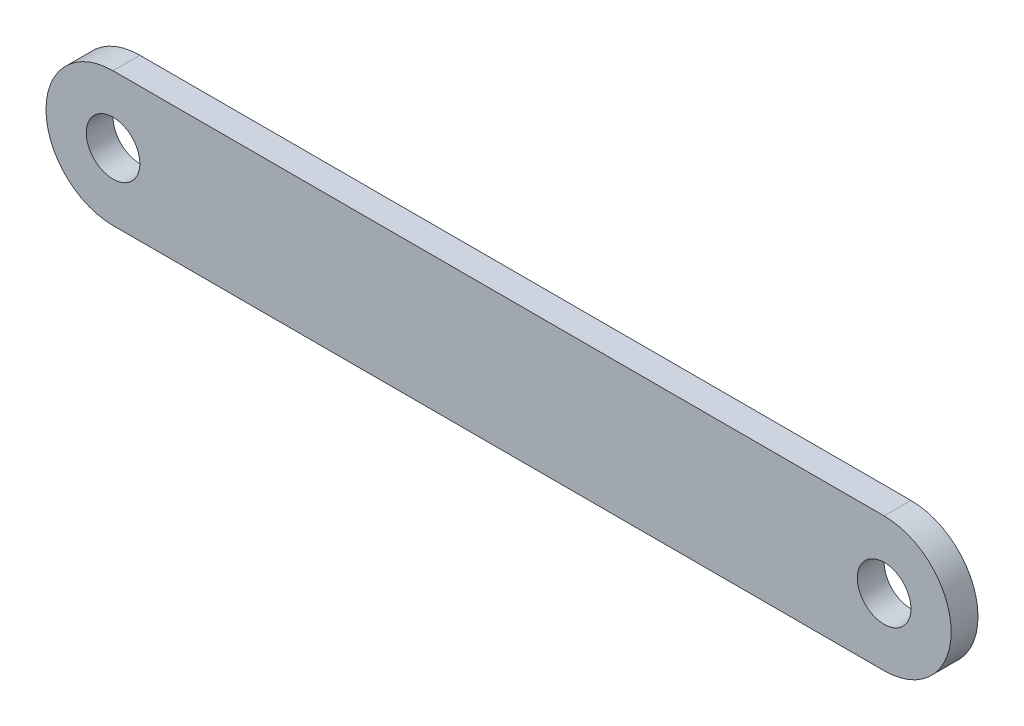
ISO-10303-21;
HEADER;
FILE_DESCRIPTION(('STEP AP214'),'2;1');
FILE_NAME('part.step','',(''),(''),'','','');
FILE_SCHEMA(('AUTOMOTIVE_DESIGN { 1 0 10303 214 1 1 1 1 }'));
ENDSEC;
DATA;
#1=APPLICATION_CONTEXT('core data for automotive mechanical design processes');
#2=APPLICATION_PROTOCOL_DEFINITION('international standard','automotive_design',2000,#1);
#3=PRODUCT_CONTEXT('',#1,'mechanical');
#4=PRODUCT('Part','Part','',(#3));
#5=PRODUCT_RELATED_PRODUCT_CATEGORY('part','',(#4));
#6=PRODUCT_DEFINITION_FORMATION('','',#4);
#7=PRODUCT_DEFINITION_CONTEXT('part definition',#1,'design');
#8=PRODUCT_DEFINITION('design','',#6,#7);
#9=PRODUCT_DEFINITION_SHAPE('','',#8);
#10=(LENGTH_UNIT() NAMED_UNIT(*) SI_UNIT(.MILLI.,.METRE.));
#11=(NAMED_UNIT(*) PLANE_ANGLE_UNIT() SI_UNIT($,.RADIAN.));
#12=(NAMED_UNIT(*) SI_UNIT($,.STERADIAN.) SOLID_ANGLE_UNIT());
#13=UNCERTAINTY_MEASURE_WITH_UNIT(LENGTH_MEASURE(1.E-05),#10,'distance_accuracy_value','');
#14=(GEOMETRIC_REPRESENTATION_CONTEXT(3) GLOBAL_UNCERTAINTY_ASSIGNED_CONTEXT((#13)) GLOBAL_UNIT_ASSIGNED_CONTEXT((#10,
#11,#12)) REPRESENTATION_CONTEXT('',''));
#15=CARTESIAN_POINT('',(0.,0.,0.));
#16=DIRECTION('',(0.,0.,1.));
#17=DIRECTION('',(1.,0.,0.));
#18=AXIS2_PLACEMENT_3D('',#15,#16,#17);
#19=CARTESIAN_POINT('',(0.,0.,2.));
#20=DIRECTION('',(0.,0.,1.));
#21=DIRECTION('',(1.,0.,0.));
#22=AXIS2_PLACEMENT_3D('',#19,#20,#21);
#23=PLANE('',#22);
#24=CARTESIAN_POINT('',(0.,0.,2.));
#25=DIRECTION('',(0.,0.,1.));
#26=DIRECTION('',(1.,0.,0.));
#27=AXIS2_PLACEMENT_3D('',#24,#25,#26);
#28=CIRCLE('',#27,2.);
#29=CARTESIAN_POINT('',(2.,0.,2.));
#30=VERTEX_POINT('',#29);
#31=EDGE_CURVE('E100',#30,#30,#28,.T.);
#32=ORIENTED_EDGE('',*,*,#31,.F.);
#33=EDGE_LOOP('',(#32));
#34=FACE_BOUND('',#33,.T.);
#35=CARTESIAN_POINT('',(0.,0.,2.));
#36=DIRECTION('',(0.,0.,1.));
#37=DIRECTION('',(1.,0.,0.));
#38=AXIS2_PLACEMENT_3D('',#35,#36,#37);
#39=CIRCLE('',#38,5.);
#40=CARTESIAN_POINT('',(0.,5.,2.));
#41=VERTEX_POINT('',#40);
#42=CARTESIAN_POINT('',(0.,-5.,2.));
#43=VERTEX_POINT('',#42);
#44=EDGE_CURVE('E85',#41,#43,#39,.T.);
#45=ORIENTED_EDGE('',*,*,#44,.T.);
#46=DIRECTION('',(1.,0.,0.));
#47=VECTOR('',#46,1.);
#48=CARTESIAN_POINT('',(0.,-5.,2.));
#49=LINE('',#48,#47);
#50=CARTESIAN_POINT('',(57.5,-5.,2.));
#51=VERTEX_POINT('',#50);
#52=EDGE_CURVE('E80',#43,#51,#49,.T.);
#53=ORIENTED_EDGE('',*,*,#52,.T.);
#54=CARTESIAN_POINT('',(57.5,0.,2.));
#55=DIRECTION('',(0.,0.,1.));
#56=DIRECTION('',(1.,0.,0.));
#57=AXIS2_PLACEMENT_3D('',#54,#55,#56);
#58=CIRCLE('',#57,5.);
#59=CARTESIAN_POINT('',(57.5,5.,2.));
#60=VERTEX_POINT('',#59);
#61=EDGE_CURVE('E83',#51,#60,#58,.T.);
#62=ORIENTED_EDGE('',*,*,#61,.T.);
#63=DIRECTION('',(-1.,0.,0.));
#64=VECTOR('',#63,1.);
#65=CARTESIAN_POINT('',(0.,5.,2.));
#66=LINE('',#65,#64);
#67=EDGE_CURVE('E50',#60,#41,#66,.T.);
#68=ORIENTED_EDGE('',*,*,#67,.T.);
#69=EDGE_LOOP('',(#45,#53,#62,#68));
#70=FACE_BOUND('',#69,.T.);
#71=CARTESIAN_POINT('',(57.5,0.,2.));
#72=DIRECTION('',(0.,0.,1.));
#73=DIRECTION('',(1.,0.,0.));
#74=AXIS2_PLACEMENT_3D('',#71,#72,#73);
#75=CIRCLE('',#74,2.);
#76=CARTESIAN_POINT('',(59.5,0.,2.));
#77=VERTEX_POINT('',#76);
#78=EDGE_CURVE('E115',#77,#77,#75,.T.);
#79=ORIENTED_EDGE('',*,*,#78,.F.);
#80=EDGE_LOOP('',(#79));
#81=FACE_BOUND('',#80,.T.);
#82=ADVANCED_FACE('F33',(#34,#70,#81),#23,.T.);
#83=CARTESIAN_POINT('',(0.,0.,0.));
#84=DIRECTION('',(0.,0.,1.));
#85=DIRECTION('',(1.,0.,0.));
#86=AXIS2_PLACEMENT_3D('',#83,#84,#85);
#87=PLANE('',#86);
#88=CARTESIAN_POINT('',(0.,0.,0.));
#89=DIRECTION('',(0.,0.,1.));
#90=DIRECTION('',(1.,0.,0.));
#91=AXIS2_PLACEMENT_3D('',#88,#89,#90);
#92=CIRCLE('',#91,2.);
#93=CARTESIAN_POINT('',(2.,0.,0.));
#94=VERTEX_POINT('',#93);
#95=EDGE_CURVE('E112',#94,#94,#92,.T.);
#96=ORIENTED_EDGE('',*,*,#95,.T.);
#97=EDGE_LOOP('',(#96));
#98=FACE_BOUND('',#97,.T.);
#99=CARTESIAN_POINT('',(0.,0.,0.));
#100=DIRECTION('',(0.,0.,1.));
#101=DIRECTION('',(1.,0.,0.));
#102=AXIS2_PLACEMENT_3D('',#99,#100,#101);
#103=CIRCLE('',#102,5.);
#104=CARTESIAN_POINT('',(0.,5.,0.));
#105=VERTEX_POINT('',#104);
#106=CARTESIAN_POINT('',(0.,-5.,0.));
#107=VERTEX_POINT('',#106);
#108=EDGE_CURVE('E97',#105,#107,#103,.T.);
#109=ORIENTED_EDGE('',*,*,#108,.F.);
#110=DIRECTION('',(-1.,0.,0.));
#111=VECTOR('',#110,1.);
#112=CARTESIAN_POINT('',(0.,5.,0.));
#113=LINE('',#112,#111);
#114=CARTESIAN_POINT('',(57.5,5.,0.));
#115=VERTEX_POINT('',#114);
#116=EDGE_CURVE('E73',#115,#105,#113,.T.);
#117=ORIENTED_EDGE('',*,*,#116,.F.);
#118=CARTESIAN_POINT('',(57.5,0.,0.));
#119=DIRECTION('',(0.,0.,1.));
#120=DIRECTION('',(1.,0.,0.));
#121=AXIS2_PLACEMENT_3D('',#118,#119,#120);
#122=CIRCLE('',#121,5.);
#123=CARTESIAN_POINT('',(57.5,-5.,0.));
#124=VERTEX_POINT('',#123);
#125=EDGE_CURVE('E67',#124,#115,#122,.T.);
#126=ORIENTED_EDGE('',*,*,#125,.F.);
#127=DIRECTION('',(1.,0.,0.));
#128=VECTOR('',#127,1.);
#129=CARTESIAN_POINT('',(0.,-5.,0.));
#130=LINE('',#129,#128);
#131=EDGE_CURVE('E89',#107,#124,#130,.T.);
#132=ORIENTED_EDGE('',*,*,#131,.F.);
#133=EDGE_LOOP('',(#109,#117,#126,#132));
#134=FACE_BOUND('',#133,.T.);
#135=CARTESIAN_POINT('',(57.5,0.,0.));
#136=DIRECTION('',(0.,0.,1.));
#137=DIRECTION('',(1.,0.,0.));
#138=AXIS2_PLACEMENT_3D('',#135,#136,#137);
#139=CIRCLE('',#138,2.);
#140=CARTESIAN_POINT('',(59.5,0.,0.));
#141=VERTEX_POINT('',#140);
#142=EDGE_CURVE('E118',#141,#141,#139,.T.);
#143=ORIENTED_EDGE('',*,*,#142,.T.);
#144=EDGE_LOOP('',(#143));
#145=FACE_BOUND('',#144,.T.);
#146=ADVANCED_FACE('F108',(#98,#134,#145),#87,.F.);
#147=CARTESIAN_POINT('',(0.,0.,2.));
#148=DIRECTION('',(0.,0.,-1.));
#149=DIRECTION('',(-1.,0.,0.));
#150=AXIS2_PLACEMENT_3D('',#147,#148,#149);
#151=CYLINDRICAL_SURFACE('',#150,5.);
#152=ORIENTED_EDGE('',*,*,#108,.T.);
#153=DIRECTION('',(0.,0.,-1.));
#154=VECTOR('',#153,1.);
#155=CARTESIAN_POINT('',(0.,-5.,2.));
#156=LINE('',#155,#154);
#157=EDGE_CURVE('E11',#43,#107,#156,.T.);
#158=ORIENTED_EDGE('',*,*,#157,.F.);
#159=ORIENTED_EDGE('',*,*,#44,.F.);
#160=DIRECTION('',(0.,0.,-1.));
#161=VECTOR('',#160,1.);
#162=CARTESIAN_POINT('',(0.,5.,2.));
#163=LINE('',#162,#161);
#164=EDGE_CURVE('E93',#41,#105,#163,.T.);
#165=ORIENTED_EDGE('',*,*,#164,.T.);
#166=EDGE_LOOP('',(#152,#158,#159,#165));
#167=FACE_BOUND('',#166,.T.);
#168=ADVANCED_FACE('F35',(#167),#151,.T.);
#169=CARTESIAN_POINT('',(0.,-5.,2.));
#170=DIRECTION('',(0.,1.,0.));
#171=DIRECTION('',(0.,0.,1.));
#172=AXIS2_PLACEMENT_3D('',#169,#170,#171);
#173=PLANE('',#172);
#174=ORIENTED_EDGE('',*,*,#131,.T.);
#175=DIRECTION('',(0.,0.,-1.));
#176=VECTOR('',#175,1.);
#177=CARTESIAN_POINT('',(57.5,-5.,2.));
#178=LINE('',#177,#176);
#179=EDGE_CURVE('E42',#51,#124,#178,.T.);
#180=ORIENTED_EDGE('',*,*,#179,.F.);
#181=ORIENTED_EDGE('',*,*,#52,.F.);
#182=ORIENTED_EDGE('',*,*,#157,.T.);
#183=EDGE_LOOP('',(#174,#180,#181,#182));
#184=FACE_BOUND('',#183,.T.);
#185=ADVANCED_FACE('F88',(#184),#173,.F.);
#186=CARTESIAN_POINT('',(57.5,0.,2.));
#187=DIRECTION('',(0.,0.,-1.));
#188=DIRECTION('',(-1.,0.,0.));
#189=AXIS2_PLACEMENT_3D('',#186,#187,#188);
#190=CYLINDRICAL_SURFACE('',#189,5.);
#191=ORIENTED_EDGE('',*,*,#125,.T.);
#192=DIRECTION('',(0.,0.,-1.));
#193=VECTOR('',#192,1.);
#194=CARTESIAN_POINT('',(57.5,5.,2.));
#195=LINE('',#194,#193);
#196=EDGE_CURVE('E90',#60,#115,#195,.T.);
#197=ORIENTED_EDGE('',*,*,#196,.F.);
#198=ORIENTED_EDGE('',*,*,#61,.F.);
#199=ORIENTED_EDGE('',*,*,#179,.T.);
#200=EDGE_LOOP('',(#191,#197,#198,#199));
#201=FACE_BOUND('',#200,.T.);
#202=ADVANCED_FACE('F91',(#201),#190,.T.);
#203=CARTESIAN_POINT('',(0.,5.,2.));
#204=DIRECTION('',(0.,-1.,0.));
#205=DIRECTION('',(0.,0.,-1.));
#206=AXIS2_PLACEMENT_3D('',#203,#204,#205);
#207=PLANE('',#206);
#208=ORIENTED_EDGE('',*,*,#116,.T.);
#209=ORIENTED_EDGE('',*,*,#164,.F.);
#210=ORIENTED_EDGE('',*,*,#67,.F.);
#211=ORIENTED_EDGE('',*,*,#196,.T.);
#212=EDGE_LOOP('',(#208,#209,#210,#211));
#213=FACE_BOUND('',#212,.T.);
#214=ADVANCED_FACE('F105',(#213),#207,.F.);
#215=CARTESIAN_POINT('',(0.,0.,2.));
#216=DIRECTION('',(0.,0.,-1.));
#217=DIRECTION('',(-1.,0.,0.));
#218=AXIS2_PLACEMENT_3D('',#215,#216,#217);
#219=CYLINDRICAL_SURFACE('',#218,2.);
#220=ORIENTED_EDGE('',*,*,#31,.T.);
#221=EDGE_LOOP('',(#220));
#222=FACE_BOUND('',#221,.T.);
#223=ORIENTED_EDGE('',*,*,#95,.F.);
#224=EDGE_LOOP('',(#223));
#225=FACE_BOUND('',#224,.T.);
#226=ADVANCED_FACE('F136',(#222,#225),#219,.F.);
#227=CARTESIAN_POINT('',(57.5,0.,2.));
#228=DIRECTION('',(0.,0.,-1.));
#229=DIRECTION('',(-1.,0.,0.));
#230=AXIS2_PLACEMENT_3D('',#227,#228,#229);
#231=CYLINDRICAL_SURFACE('',#230,2.);
#232=ORIENTED_EDGE('',*,*,#78,.T.);
#233=EDGE_LOOP('',(#232));
#234=FACE_BOUND('',#233,.T.);
#235=ORIENTED_EDGE('',*,*,#142,.F.);
#236=EDGE_LOOP('',(#235));
#237=FACE_BOUND('',#236,.T.);
#238=ADVANCED_FACE('F124',(#234,#237),#231,.F.);
#239=CLOSED_SHELL('',(#82,#146,#168,#185,#202,#214,#226,#238));
#240=MANIFOLD_SOLID_BREP('B2',#239);
#241=ADVANCED_BREP_SHAPE_REPRESENTATION('',(#18,#240),#14);
#242=SHAPE_DEFINITION_REPRESENTATION(#9,#241);
ENDSEC;
END-ISO-10303-21;
